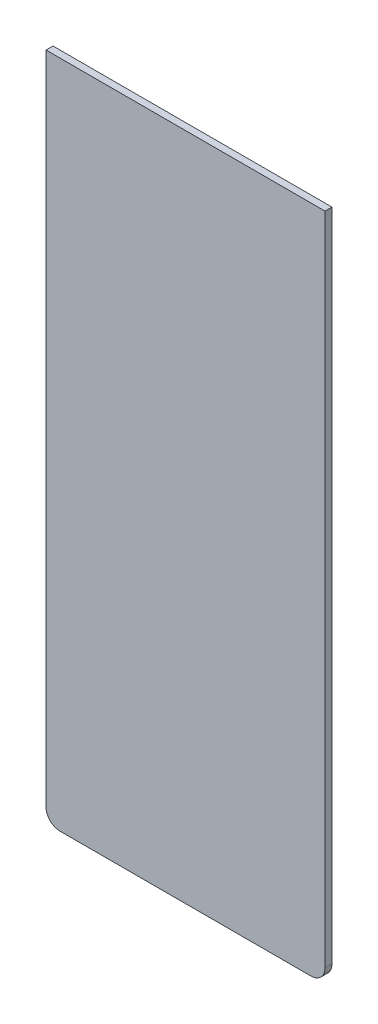
ISO-10303-21;
HEADER;
FILE_DESCRIPTION(('STEP AP214'),'2;1');
FILE_NAME('part.step','',(''),(''),'','','');
FILE_SCHEMA(('AUTOMOTIVE_DESIGN { 1 0 10303 214 1 1 1 1 }'));
ENDSEC;
DATA;
#1=APPLICATION_CONTEXT('core data for automotive mechanical design processes');
#2=APPLICATION_PROTOCOL_DEFINITION('international standard','automotive_design',2000,#1);
#3=PRODUCT_CONTEXT('',#1,'mechanical');
#4=PRODUCT('Part','Part','',(#3));
#5=PRODUCT_RELATED_PRODUCT_CATEGORY('part','',(#4));
#6=PRODUCT_DEFINITION_FORMATION('','',#4);
#7=PRODUCT_DEFINITION_CONTEXT('part definition',#1,'design');
#8=PRODUCT_DEFINITION('design','',#6,#7);
#9=PRODUCT_DEFINITION_SHAPE('','',#8);
#10=(LENGTH_UNIT() NAMED_UNIT(*) SI_UNIT(.MILLI.,.METRE.));
#11=(NAMED_UNIT(*) PLANE_ANGLE_UNIT() SI_UNIT($,.RADIAN.));
#12=(NAMED_UNIT(*) SI_UNIT($,.STERADIAN.) SOLID_ANGLE_UNIT());
#13=UNCERTAINTY_MEASURE_WITH_UNIT(LENGTH_MEASURE(1.E-05),#10,'distance_accuracy_value','');
#14=(GEOMETRIC_REPRESENTATION_CONTEXT(3) GLOBAL_UNCERTAINTY_ASSIGNED_CONTEXT((#13)) GLOBAL_UNIT_ASSIGNED_CONTEXT((#10,
#11,#12)) REPRESENTATION_CONTEXT('',''));
#15=CARTESIAN_POINT('',(0.,0.,0.));
#16=DIRECTION('',(0.,0.,1.));
#17=DIRECTION('',(1.,0.,0.));
#18=AXIS2_PLACEMENT_3D('',#15,#16,#17);
#19=CARTESIAN_POINT('',(100.,-240.,5.));
#20=DIRECTION('',(-1.,0.,0.));
#21=DIRECTION('',(0.,0.,1.));
#22=AXIS2_PLACEMENT_3D('',#19,#20,#21);
#23=PLANE('',#22);
#24=DIRECTION('',(0.,1.,0.));
#25=VECTOR('',#24,1.);
#26=CARTESIAN_POINT('',(100.,-240.,5.));
#27=LINE('',#26,#25);
#28=CARTESIAN_POINT('',(100.,-230.,5.));
#29=VERTEX_POINT('',#28);
#30=CARTESIAN_POINT('',(100.,240.,5.));
#31=VERTEX_POINT('',#30);
#32=EDGE_CURVE('E93',#29,#31,#27,.T.);
#33=ORIENTED_EDGE('',*,*,#32,.F.);
#34=DIRECTION('',(0.,0.,-1.));
#35=VECTOR('',#34,1.);
#36=CARTESIAN_POINT('',(100.,-230.,5.));
#37=LINE('',#36,#35);
#38=CARTESIAN_POINT('',(100.,-230.,0.));
#39=VERTEX_POINT('',#38);
#40=EDGE_CURVE('E11',#29,#39,#37,.T.);
#41=ORIENTED_EDGE('',*,*,#40,.T.);
#42=DIRECTION('',(0.,1.,0.));
#43=VECTOR('',#42,1.);
#44=CARTESIAN_POINT('',(100.,-240.,0.));
#45=LINE('',#44,#43);
#46=CARTESIAN_POINT('',(100.,240.,0.));
#47=VERTEX_POINT('',#46);
#48=EDGE_CURVE('E114',#39,#47,#45,.T.);
#49=ORIENTED_EDGE('',*,*,#48,.T.);
#50=DIRECTION('',(0.,0.,-1.));
#51=VECTOR('',#50,1.);
#52=CARTESIAN_POINT('',(100.,240.,5.));
#53=LINE('',#52,#51);
#54=EDGE_CURVE('E107',#31,#47,#53,.T.);
#55=ORIENTED_EDGE('',*,*,#54,.F.);
#56=EDGE_LOOP('',(#33,#41,#49,#55));
#57=FACE_BOUND('',#56,.T.);
#58=ADVANCED_FACE('F39',(#57),#23,.F.);
#59=CARTESIAN_POINT('',(-100.,240.,5.));
#60=DIRECTION('',(0.,-1.,0.));
#61=DIRECTION('',(0.,0.,-1.));
#62=AXIS2_PLACEMENT_3D('',#59,#60,#61);
#63=PLANE('',#62);
#64=DIRECTION('',(-1.,0.,0.));
#65=VECTOR('',#64,1.);
#66=CARTESIAN_POINT('',(-100.,240.,0.));
#67=LINE('',#66,#65);
#68=CARTESIAN_POINT('',(-100.,240.,0.));
#69=VERTEX_POINT('',#68);
#70=EDGE_CURVE('E158',#47,#69,#67,.T.);
#71=ORIENTED_EDGE('',*,*,#70,.T.);
#72=DIRECTION('',(0.,0.,-1.));
#73=VECTOR('',#72,1.);
#74=CARTESIAN_POINT('',(-100.,240.,5.));
#75=LINE('',#74,#73);
#76=CARTESIAN_POINT('',(-100.,240.,5.));
#77=VERTEX_POINT('',#76);
#78=EDGE_CURVE('E109',#77,#69,#75,.T.);
#79=ORIENTED_EDGE('',*,*,#78,.F.);
#80=DIRECTION('',(-1.,0.,0.));
#81=VECTOR('',#80,1.);
#82=CARTESIAN_POINT('',(-100.,240.,5.));
#83=LINE('',#82,#81);
#84=EDGE_CURVE('E96',#31,#77,#83,.T.);
#85=ORIENTED_EDGE('',*,*,#84,.F.);
#86=ORIENTED_EDGE('',*,*,#54,.T.);
#87=EDGE_LOOP('',(#71,#79,#85,#86));
#88=FACE_BOUND('',#87,.T.);
#89=ADVANCED_FACE('F106',(#88),#63,.F.);
#90=CARTESIAN_POINT('',(-100.,-240.,5.));
#91=DIRECTION('',(1.,0.,0.));
#92=DIRECTION('',(0.,0.,-1.));
#93=AXIS2_PLACEMENT_3D('',#90,#91,#92);
#94=PLANE('',#93);
#95=DIRECTION('',(0.,-1.,0.));
#96=VECTOR('',#95,1.);
#97=CARTESIAN_POINT('',(-100.,-240.,0.));
#98=LINE('',#97,#96);
#99=CARTESIAN_POINT('',(-100.,-230.,0.));
#100=VERTEX_POINT('',#99);
#101=EDGE_CURVE('E155',#69,#100,#98,.T.);
#102=ORIENTED_EDGE('',*,*,#101,.T.);
#103=DIRECTION('',(0.,0.,-1.));
#104=VECTOR('',#103,1.);
#105=CARTESIAN_POINT('',(-100.,-230.,5.));
#106=LINE('',#105,#104);
#107=CARTESIAN_POINT('',(-100.,-230.,5.));
#108=VERTEX_POINT('',#107);
#109=EDGE_CURVE('E63',#100,#108,#106,.F.);
#110=ORIENTED_EDGE('',*,*,#109,.T.);
#111=DIRECTION('',(0.,-1.,0.));
#112=VECTOR('',#111,1.);
#113=CARTESIAN_POINT('',(-100.,-240.,5.));
#114=LINE('',#113,#112);
#115=EDGE_CURVE('E111',#77,#108,#114,.T.);
#116=ORIENTED_EDGE('',*,*,#115,.F.);
#117=ORIENTED_EDGE('',*,*,#78,.T.);
#118=EDGE_LOOP('',(#102,#110,#116,#117));
#119=FACE_BOUND('',#118,.T.);
#120=ADVANCED_FACE('F156',(#119),#94,.F.);
#121=CARTESIAN_POINT('',(-100.,-240.,5.));
#122=DIRECTION('',(0.,1.,0.));
#123=DIRECTION('',(0.,0.,1.));
#124=AXIS2_PLACEMENT_3D('',#121,#122,#123);
#125=PLANE('',#124);
#126=DIRECTION('',(1.,0.,0.));
#127=VECTOR('',#126,1.);
#128=CARTESIAN_POINT('',(-100.,-240.,5.));
#129=LINE('',#128,#127);
#130=CARTESIAN_POINT('',(-90.,-240.,5.));
#131=VERTEX_POINT('',#130);
#132=CARTESIAN_POINT('',(90.,-240.,5.));
#133=VERTEX_POINT('',#132);
#134=EDGE_CURVE('E123',#131,#133,#129,.T.);
#135=ORIENTED_EDGE('',*,*,#134,.F.);
#136=DIRECTION('',(0.,0.,-1.));
#137=VECTOR('',#136,1.);
#138=CARTESIAN_POINT('',(-90.,-240.,5.));
#139=LINE('',#138,#137);
#140=CARTESIAN_POINT('',(-90.,-240.,0.));
#141=VERTEX_POINT('',#140);
#142=EDGE_CURVE('E121',#131,#141,#139,.T.);
#143=ORIENTED_EDGE('',*,*,#142,.T.);
#144=DIRECTION('',(1.,0.,0.));
#145=VECTOR('',#144,1.);
#146=CARTESIAN_POINT('',(-100.,-240.,0.));
#147=LINE('',#146,#145);
#148=CARTESIAN_POINT('',(90.,-240.,0.));
#149=VERTEX_POINT('',#148);
#150=EDGE_CURVE('E102',#141,#149,#147,.T.);
#151=ORIENTED_EDGE('',*,*,#150,.T.);
#152=DIRECTION('',(0.,0.,-1.));
#153=VECTOR('',#152,1.);
#154=CARTESIAN_POINT('',(90.,-240.,5.));
#155=LINE('',#154,#153);
#156=EDGE_CURVE('E117',#149,#133,#155,.F.);
#157=ORIENTED_EDGE('',*,*,#156,.T.);
#158=EDGE_LOOP('',(#135,#143,#151,#157));
#159=FACE_BOUND('',#158,.T.);
#160=ADVANCED_FACE('F145',(#159),#125,.F.);
#161=CARTESIAN_POINT('',(0.,0.,5.));
#162=DIRECTION('',(0.,0.,-1.));
#163=DIRECTION('',(-1.,0.,0.));
#164=AXIS2_PLACEMENT_3D('',#161,#162,#163);
#165=PLANE('',#164);
#166=ORIENTED_EDGE('',*,*,#115,.T.);
#167=CARTESIAN_POINT('',(-90.,-230.,5.));
#168=DIRECTION('',(0.,0.,-1.));
#169=DIRECTION('',(-1.,0.,0.));
#170=AXIS2_PLACEMENT_3D('',#167,#168,#169);
#171=CIRCLE('',#170,10.);
#172=EDGE_CURVE('E48',#108,#131,#171,.F.);
#173=ORIENTED_EDGE('',*,*,#172,.T.);
#174=ORIENTED_EDGE('',*,*,#134,.T.);
#175=CARTESIAN_POINT('',(90.,-230.,5.));
#176=DIRECTION('',(0.,0.,-1.));
#177=DIRECTION('',(-1.,0.,0.));
#178=AXIS2_PLACEMENT_3D('',#175,#176,#177);
#179=CIRCLE('',#178,10.);
#180=EDGE_CURVE('E55',#133,#29,#179,.F.);
#181=ORIENTED_EDGE('',*,*,#180,.T.);
#182=ORIENTED_EDGE('',*,*,#32,.T.);
#183=ORIENTED_EDGE('',*,*,#84,.T.);
#184=EDGE_LOOP('',(#166,#173,#174,#181,#182,#183));
#185=FACE_BOUND('',#184,.T.);
#186=ADVANCED_FACE('F95',(#185),#165,.F.);
#187=CARTESIAN_POINT('',(0.,0.,0.));
#188=DIRECTION('',(0.,0.,-1.));
#189=DIRECTION('',(-1.,0.,0.));
#190=AXIS2_PLACEMENT_3D('',#187,#188,#189);
#191=PLANE('',#190);
#192=ORIENTED_EDGE('',*,*,#150,.F.);
#193=CARTESIAN_POINT('',(-90.,-230.,0.));
#194=DIRECTION('',(0.,0.,-1.));
#195=DIRECTION('',(-1.,0.,0.));
#196=AXIS2_PLACEMENT_3D('',#193,#194,#195);
#197=CIRCLE('',#196,10.);
#198=EDGE_CURVE('E133',#141,#100,#197,.T.);
#199=ORIENTED_EDGE('',*,*,#198,.T.);
#200=ORIENTED_EDGE('',*,*,#101,.F.);
#201=ORIENTED_EDGE('',*,*,#70,.F.);
#202=ORIENTED_EDGE('',*,*,#48,.F.);
#203=CARTESIAN_POINT('',(90.,-230.,0.));
#204=DIRECTION('',(0.,0.,-1.));
#205=DIRECTION('',(-1.,0.,0.));
#206=AXIS2_PLACEMENT_3D('',#203,#204,#205);
#207=CIRCLE('',#206,10.);
#208=EDGE_CURVE('E130',#39,#149,#207,.T.);
#209=ORIENTED_EDGE('',*,*,#208,.T.);
#210=EDGE_LOOP('',(#192,#199,#200,#201,#202,#209));
#211=FACE_BOUND('',#210,.T.);
#212=ADVANCED_FACE('F154',(#211),#191,.T.);
#213=CARTESIAN_POINT('',(-90.,-230.,5.));
#214=DIRECTION('',(0.,0.,-1.));
#215=DIRECTION('',(-1.,0.,0.));
#216=AXIS2_PLACEMENT_3D('',#213,#214,#215);
#217=CYLINDRICAL_SURFACE('',#216,10.);
#218=ORIENTED_EDGE('',*,*,#172,.F.);
#219=ORIENTED_EDGE('',*,*,#109,.F.);
#220=ORIENTED_EDGE('',*,*,#198,.F.);
#221=ORIENTED_EDGE('',*,*,#142,.F.);
#222=EDGE_LOOP('',(#218,#219,#220,#221));
#223=FACE_BOUND('',#222,.T.);
#224=ADVANCED_FACE('F151',(#223),#217,.T.);
#225=CARTESIAN_POINT('',(90.,-230.,5.));
#226=DIRECTION('',(0.,0.,-1.));
#227=DIRECTION('',(-1.,0.,0.));
#228=AXIS2_PLACEMENT_3D('',#225,#226,#227);
#229=CYLINDRICAL_SURFACE('',#228,10.);
#230=ORIENTED_EDGE('',*,*,#180,.F.);
#231=ORIENTED_EDGE('',*,*,#156,.F.);
#232=ORIENTED_EDGE('',*,*,#208,.F.);
#233=ORIENTED_EDGE('',*,*,#40,.F.);
#234=EDGE_LOOP('',(#230,#231,#232,#233));
#235=FACE_BOUND('',#234,.T.);
#236=ADVANCED_FACE('F41',(#235),#229,.T.);
#237=CLOSED_SHELL('',(#58,#89,#120,#160,#186,#212,#224,#236));
#238=MANIFOLD_SOLID_BREP('B2',#237);
#239=ADVANCED_BREP_SHAPE_REPRESENTATION('',(#18,#238),#14);
#240=SHAPE_DEFINITION_REPRESENTATION(#9,#239);
ENDSEC;
END-ISO-10303-21;
